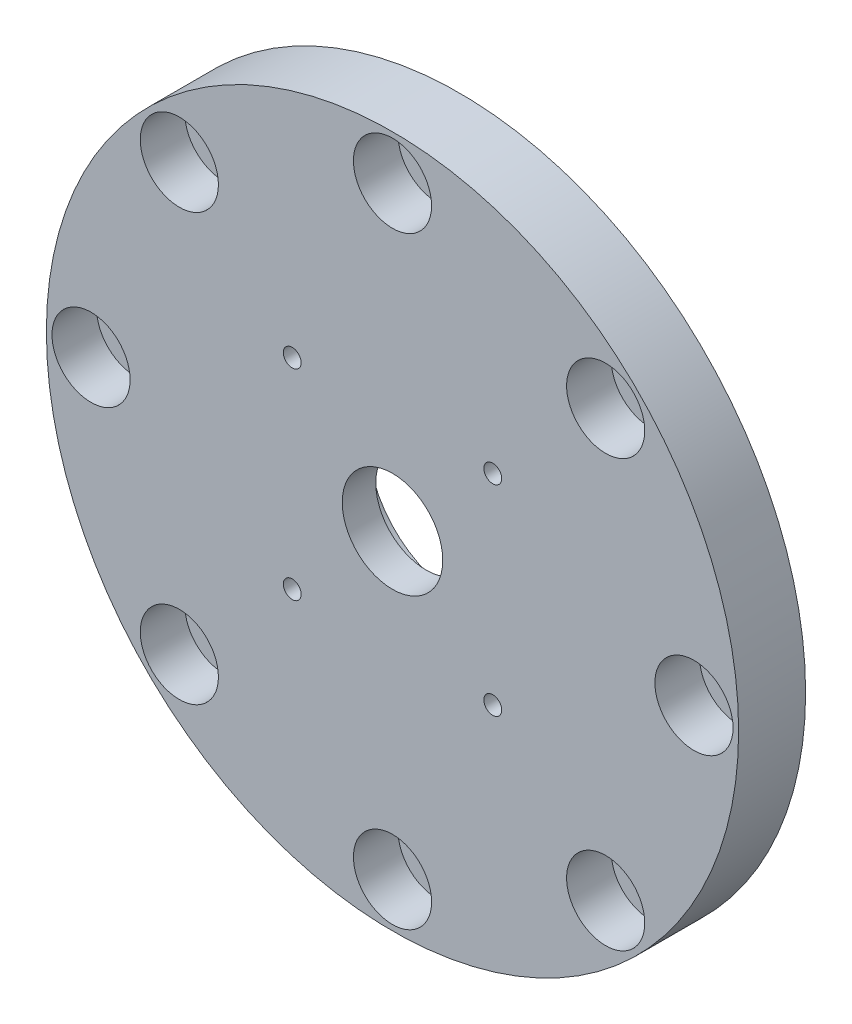
ISO-10303-21;
HEADER;
FILE_DESCRIPTION(('STEP AP214'),'2;1');
FILE_NAME('part.step','',(''),(''),'','','');
FILE_SCHEMA(('AUTOMOTIVE_DESIGN { 1 0 10303 214 1 1 1 1 }'));
ENDSEC;
DATA;
#1=APPLICATION_CONTEXT('core data for automotive mechanical design processes');
#2=APPLICATION_PROTOCOL_DEFINITION('international standard','automotive_design',2000,#1);
#3=PRODUCT_CONTEXT('',#1,'mechanical');
#4=PRODUCT('Part','Part','',(#3));
#5=PRODUCT_RELATED_PRODUCT_CATEGORY('part','',(#4));
#6=PRODUCT_DEFINITION_FORMATION('','',#4);
#7=PRODUCT_DEFINITION_CONTEXT('part definition',#1,'design');
#8=PRODUCT_DEFINITION('design','',#6,#7);
#9=PRODUCT_DEFINITION_SHAPE('','',#8);
#10=(LENGTH_UNIT() NAMED_UNIT(*) SI_UNIT(.MILLI.,.METRE.));
#11=(NAMED_UNIT(*) PLANE_ANGLE_UNIT() SI_UNIT($,.RADIAN.));
#12=(NAMED_UNIT(*) SI_UNIT($,.STERADIAN.) SOLID_ANGLE_UNIT());
#13=UNCERTAINTY_MEASURE_WITH_UNIT(LENGTH_MEASURE(1.E-05),#10,'distance_accuracy_value','');
#14=(GEOMETRIC_REPRESENTATION_CONTEXT(3) GLOBAL_UNCERTAINTY_ASSIGNED_CONTEXT((#13)) GLOBAL_UNIT_ASSIGNED_CONTEXT((#10,
#11,#12)) REPRESENTATION_CONTEXT('',''));
#15=CARTESIAN_POINT('',(0.,0.,0.));
#16=DIRECTION('',(0.,0.,1.));
#17=DIRECTION('',(1.,0.,0.));
#18=AXIS2_PLACEMENT_3D('',#15,#16,#17);
#19=CARTESIAN_POINT('',(-27.,0.,6.));
#20=DIRECTION('',(0.,0.,-1.));
#21=DIRECTION('',(-1.,0.,0.));
#22=AXIS2_PLACEMENT_3D('',#19,#20,#21);
#23=CYLINDRICAL_SURFACE('',#22,1.55);
#24=CARTESIAN_POINT('',(-27.,0.,0.));
#25=DIRECTION('',(0.,0.,1.));
#26=DIRECTION('',(1.,0.,0.));
#27=AXIS2_PLACEMENT_3D('',#24,#25,#26);
#28=CIRCLE('',#27,1.55);
#29=CARTESIAN_POINT('',(-25.45,0.,0.));
#30=VERTEX_POINT('',#29);
#31=EDGE_CURVE('E131',#30,#30,#28,.T.);
#32=ORIENTED_EDGE('',*,*,#31,.F.);
#33=EDGE_LOOP('',(#32));
#34=FACE_BOUND('',#33,.T.);
#35=CARTESIAN_POINT('',(-27.,0.,2.));
#36=DIRECTION('',(0.,0.,1.));
#37=DIRECTION('',(1.,0.,0.));
#38=AXIS2_PLACEMENT_3D('',#35,#36,#37);
#39=CIRCLE('',#38,1.55);
#40=CARTESIAN_POINT('',(-25.45,0.,2.));
#41=VERTEX_POINT('',#40);
#42=EDGE_CURVE('E39',#41,#41,#39,.T.);
#43=ORIENTED_EDGE('',*,*,#42,.T.);
#44=EDGE_LOOP('',(#43));
#45=FACE_BOUND('',#44,.T.);
#46=ADVANCED_FACE('F35',(#34,#45),#23,.F.);
#47=CARTESIAN_POINT('',(-19.0918830920367,19.0918830920368,6.));
#48=DIRECTION('',(0.,0.,-1.));
#49=DIRECTION('',(-1.,0.,0.));
#50=AXIS2_PLACEMENT_3D('',#47,#48,#49);
#51=CYLINDRICAL_SURFACE('',#50,1.54999999999999);
#52=CARTESIAN_POINT('',(-19.0918830920367,19.0918830920368,0.));
#53=DIRECTION('',(0.,0.,1.));
#54=DIRECTION('',(1.,0.,0.));
#55=AXIS2_PLACEMENT_3D('',#52,#53,#54);
#56=CIRCLE('',#55,1.54999999999999);
#57=CARTESIAN_POINT('',(-17.5418830920368,19.0918830920368,0.));
#58=VERTEX_POINT('',#57);
#59=EDGE_CURVE('E128',#58,#58,#56,.T.);
#60=ORIENTED_EDGE('',*,*,#59,.F.);
#61=EDGE_LOOP('',(#60));
#62=FACE_BOUND('',#61,.T.);
#63=CARTESIAN_POINT('',(-19.0918830920367,19.0918830920368,2.));
#64=DIRECTION('',(0.,0.,1.));
#65=DIRECTION('',(1.,0.,0.));
#66=AXIS2_PLACEMENT_3D('',#63,#64,#65);
#67=CIRCLE('',#66,1.54999999999999);
#68=CARTESIAN_POINT('',(-17.5418830920368,19.0918830920368,2.));
#69=VERTEX_POINT('',#68);
#70=EDGE_CURVE('E77',#69,#69,#67,.T.);
#71=ORIENTED_EDGE('',*,*,#70,.T.);
#72=EDGE_LOOP('',(#71));
#73=FACE_BOUND('',#72,.T.);
#74=ADVANCED_FACE('F160',(#62,#73),#51,.F.);
#75=CARTESIAN_POINT('',(0.,27.,6.));
#76=DIRECTION('',(0.,0.,-1.));
#77=DIRECTION('',(-1.,0.,0.));
#78=AXIS2_PLACEMENT_3D('',#75,#76,#77);
#79=CYLINDRICAL_SURFACE('',#78,1.55);
#80=CARTESIAN_POINT('',(0.,27.,0.));
#81=DIRECTION('',(0.,0.,1.));
#82=DIRECTION('',(1.,0.,0.));
#83=AXIS2_PLACEMENT_3D('',#80,#81,#82);
#84=CIRCLE('',#83,1.55);
#85=CARTESIAN_POINT('',(1.55000000000009,27.,0.));
#86=VERTEX_POINT('',#85);
#87=EDGE_CURVE('E125',#86,#86,#84,.T.);
#88=ORIENTED_EDGE('',*,*,#87,.F.);
#89=EDGE_LOOP('',(#88));
#90=FACE_BOUND('',#89,.T.);
#91=CARTESIAN_POINT('',(0.,27.,2.));
#92=DIRECTION('',(0.,0.,1.));
#93=DIRECTION('',(1.,0.,0.));
#94=AXIS2_PLACEMENT_3D('',#91,#92,#93);
#95=CIRCLE('',#94,1.55);
#96=CARTESIAN_POINT('',(1.55000000000009,27.,2.));
#97=VERTEX_POINT('',#96);
#98=EDGE_CURVE('E75',#97,#97,#95,.T.);
#99=ORIENTED_EDGE('',*,*,#98,.T.);
#100=EDGE_LOOP('',(#99));
#101=FACE_BOUND('',#100,.T.);
#102=ADVANCED_FACE('F166',(#90,#101),#79,.F.);
#103=CARTESIAN_POINT('',(19.0918830920369,19.0918830920367,6.));
#104=DIRECTION('',(0.,0.,-1.));
#105=DIRECTION('',(-1.,0.,0.));
#106=AXIS2_PLACEMENT_3D('',#103,#104,#105);
#107=CYLINDRICAL_SURFACE('',#106,1.55);
#108=CARTESIAN_POINT('',(19.0918830920369,19.0918830920367,0.));
#109=DIRECTION('',(0.,0.,1.));
#110=DIRECTION('',(1.,0.,0.));
#111=AXIS2_PLACEMENT_3D('',#108,#109,#110);
#112=CIRCLE('',#111,1.55);
#113=CARTESIAN_POINT('',(20.6418830920369,19.0918830920367,0.));
#114=VERTEX_POINT('',#113);
#115=EDGE_CURVE('E120',#114,#114,#112,.T.);
#116=ORIENTED_EDGE('',*,*,#115,.F.);
#117=EDGE_LOOP('',(#116));
#118=FACE_BOUND('',#117,.T.);
#119=CARTESIAN_POINT('',(19.0918830920369,19.0918830920367,2.));
#120=DIRECTION('',(0.,0.,1.));
#121=DIRECTION('',(1.,0.,0.));
#122=AXIS2_PLACEMENT_3D('',#119,#120,#121);
#123=CIRCLE('',#122,1.55);
#124=CARTESIAN_POINT('',(20.6418830920369,19.0918830920367,2.));
#125=VERTEX_POINT('',#124);
#126=EDGE_CURVE('E72',#125,#125,#123,.T.);
#127=ORIENTED_EDGE('',*,*,#126,.T.);
#128=EDGE_LOOP('',(#127));
#129=FACE_BOUND('',#128,.T.);
#130=ADVANCED_FACE('F215',(#118,#129),#107,.F.);
#131=CARTESIAN_POINT('',(27.,-1.85233445939831E-13,6.));
#132=DIRECTION('',(0.,0.,-1.));
#133=DIRECTION('',(-1.,0.,0.));
#134=AXIS2_PLACEMENT_3D('',#131,#132,#133);
#135=CYLINDRICAL_SURFACE('',#134,1.55);
#136=CARTESIAN_POINT('',(27.,-1.85233445939831E-13,0.));
#137=DIRECTION('',(0.,0.,1.));
#138=DIRECTION('',(1.,0.,0.));
#139=AXIS2_PLACEMENT_3D('',#136,#137,#138);
#140=CIRCLE('',#139,1.55);
#141=CARTESIAN_POINT('',(28.55,-1.85233445939831E-13,0.));
#142=VERTEX_POINT('',#141);
#143=EDGE_CURVE('E101',#142,#142,#140,.T.);
#144=ORIENTED_EDGE('',*,*,#143,.F.);
#145=EDGE_LOOP('',(#144));
#146=FACE_BOUND('',#145,.T.);
#147=CARTESIAN_POINT('',(27.,-1.85233445939831E-13,2.));
#148=DIRECTION('',(0.,0.,1.));
#149=DIRECTION('',(1.,0.,0.));
#150=AXIS2_PLACEMENT_3D('',#147,#148,#149);
#151=CIRCLE('',#150,1.55);
#152=CARTESIAN_POINT('',(28.55,-1.85233445939831E-13,2.));
#153=VERTEX_POINT('',#152);
#154=EDGE_CURVE('E69',#153,#153,#151,.T.);
#155=ORIENTED_EDGE('',*,*,#154,.T.);
#156=EDGE_LOOP('',(#155));
#157=FACE_BOUND('',#156,.T.);
#158=ADVANCED_FACE('F212',(#146,#157),#135,.F.);
#159=CARTESIAN_POINT('',(19.0918830920366,-19.0918830920369,6.));
#160=DIRECTION('',(0.,0.,-1.));
#161=DIRECTION('',(-1.,0.,0.));
#162=AXIS2_PLACEMENT_3D('',#159,#160,#161);
#163=CYLINDRICAL_SURFACE('',#162,1.55);
#164=CARTESIAN_POINT('',(19.0918830920366,-19.0918830920369,0.));
#165=DIRECTION('',(0.,0.,1.));
#166=DIRECTION('',(1.,0.,0.));
#167=AXIS2_PLACEMENT_3D('',#164,#165,#166);
#168=CIRCLE('',#167,1.55);
#169=CARTESIAN_POINT('',(20.6418830920366,-19.0918830920369,0.));
#170=VERTEX_POINT('',#169);
#171=EDGE_CURVE('E98',#170,#170,#168,.T.);
#172=ORIENTED_EDGE('',*,*,#171,.F.);
#173=EDGE_LOOP('',(#172));
#174=FACE_BOUND('',#173,.T.);
#175=CARTESIAN_POINT('',(19.0918830920366,-19.0918830920369,2.));
#176=DIRECTION('',(0.,0.,1.));
#177=DIRECTION('',(1.,0.,0.));
#178=AXIS2_PLACEMENT_3D('',#175,#176,#177);
#179=CIRCLE('',#178,1.55);
#180=CARTESIAN_POINT('',(20.6418830920366,-19.0918830920369,2.));
#181=VERTEX_POINT('',#180);
#182=EDGE_CURVE('E66',#181,#181,#179,.T.);
#183=ORIENTED_EDGE('',*,*,#182,.T.);
#184=EDGE_LOOP('',(#183));
#185=FACE_BOUND('',#184,.T.);
#186=ADVANCED_FACE('F208',(#174,#185),#163,.F.);
#187=CARTESIAN_POINT('',(-2.79503442088596E-13,-27.,6.));
#188=DIRECTION('',(0.,0.,-1.));
#189=DIRECTION('',(-1.,0.,0.));
#190=AXIS2_PLACEMENT_3D('',#187,#188,#189);
#191=CYLINDRICAL_SURFACE('',#190,1.55);
#192=CARTESIAN_POINT('',(-2.79503442088596E-13,-27.,0.));
#193=DIRECTION('',(0.,0.,1.));
#194=DIRECTION('',(1.,0.,0.));
#195=AXIS2_PLACEMENT_3D('',#192,#193,#194);
#196=CIRCLE('',#195,1.55);
#197=CARTESIAN_POINT('',(1.54999999999972,-27.,0.));
#198=VERTEX_POINT('',#197);
#199=EDGE_CURVE('E95',#198,#198,#196,.T.);
#200=ORIENTED_EDGE('',*,*,#199,.F.);
#201=EDGE_LOOP('',(#200));
#202=FACE_BOUND('',#201,.T.);
#203=CARTESIAN_POINT('',(-2.79503442088596E-13,-27.,2.));
#204=DIRECTION('',(0.,0.,1.));
#205=DIRECTION('',(1.,0.,0.));
#206=AXIS2_PLACEMENT_3D('',#203,#204,#205);
#207=CIRCLE('',#206,1.55);
#208=CARTESIAN_POINT('',(1.54999999999972,-27.,2.));
#209=VERTEX_POINT('',#208);
#210=EDGE_CURVE('E62',#209,#209,#207,.T.);
#211=ORIENTED_EDGE('',*,*,#210,.T.);
#212=EDGE_LOOP('',(#211));
#213=FACE_BOUND('',#212,.T.);
#214=ADVANCED_FACE('F181',(#202,#213),#191,.F.);
#215=CARTESIAN_POINT('',(-19.091883092037,-19.0918830920366,6.));
#216=DIRECTION('',(0.,0.,-1.));
#217=DIRECTION('',(-1.,0.,0.));
#218=AXIS2_PLACEMENT_3D('',#215,#216,#217);
#219=CYLINDRICAL_SURFACE('',#218,1.55);
#220=CARTESIAN_POINT('',(-19.091883092037,-19.0918830920366,0.));
#221=DIRECTION('',(0.,0.,1.));
#222=DIRECTION('',(1.,0.,0.));
#223=AXIS2_PLACEMENT_3D('',#220,#221,#222);
#224=CIRCLE('',#223,1.55);
#225=CARTESIAN_POINT('',(-17.541883092037,-19.0918830920366,0.));
#226=VERTEX_POINT('',#225);
#227=EDGE_CURVE('E57',#226,#226,#224,.T.);
#228=ORIENTED_EDGE('',*,*,#227,.F.);
#229=EDGE_LOOP('',(#228));
#230=FACE_BOUND('',#229,.T.);
#231=CARTESIAN_POINT('',(-19.091883092037,-19.0918830920366,2.));
#232=DIRECTION('',(0.,0.,1.));
#233=DIRECTION('',(1.,0.,0.));
#234=AXIS2_PLACEMENT_3D('',#231,#232,#233);
#235=CIRCLE('',#234,1.55);
#236=CARTESIAN_POINT('',(-17.541883092037,-19.0918830920366,2.));
#237=VERTEX_POINT('',#236);
#238=EDGE_CURVE('E59',#237,#237,#235,.T.);
#239=ORIENTED_EDGE('',*,*,#238,.T.);
#240=EDGE_LOOP('',(#239));
#241=FACE_BOUND('',#240,.T.);
#242=ADVANCED_FACE('F174',(#230,#241),#219,.F.);
#243=CARTESIAN_POINT('',(0.,0.,6.));
#244=DIRECTION('',(0.,0.,-1.));
#245=DIRECTION('',(-1.,0.,0.));
#246=AXIS2_PLACEMENT_3D('',#243,#244,#245);
#247=CYLINDRICAL_SURFACE('',#246,4.5);
#248=CARTESIAN_POINT('',(0.,0.,6.));
#249=DIRECTION('',(0.,0.,1.));
#250=DIRECTION('',(1.,0.,0.));
#251=AXIS2_PLACEMENT_3D('',#248,#249,#250);
#252=CIRCLE('',#251,4.5);
#253=CARTESIAN_POINT('',(4.5,0.,6.));
#254=VERTEX_POINT('',#253);
#255=EDGE_CURVE('E134',#254,#254,#252,.T.);
#256=ORIENTED_EDGE('',*,*,#255,.T.);
#257=EDGE_LOOP('',(#256));
#258=FACE_BOUND('',#257,.T.);
#259=CARTESIAN_POINT('',(0.,0.,3.));
#260=DIRECTION('',(0.,0.,-1.));
#261=DIRECTION('',(-1.,0.,0.));
#262=AXIS2_PLACEMENT_3D('',#259,#260,#261);
#263=CIRCLE('',#262,4.5);
#264=CARTESIAN_POINT('',(-4.5,0.,3.));
#265=VERTEX_POINT('',#264);
#266=EDGE_CURVE('E54',#265,#265,#263,.T.);
#267=ORIENTED_EDGE('',*,*,#266,.T.);
#268=EDGE_LOOP('',(#267));
#269=FACE_BOUND('',#268,.T.);
#270=ADVANCED_FACE('F171',(#258,#269),#247,.F.);
#271=CARTESIAN_POINT('',(0.,0.,6.));
#272=DIRECTION('',(0.,0.,1.));
#273=DIRECTION('',(1.,0.,0.));
#274=AXIS2_PLACEMENT_3D('',#271,#272,#273);
#275=PLANE('',#274);
#276=CARTESIAN_POINT('',(0.,27.,6.));
#277=DIRECTION('',(0.,0.,1.));
#278=DIRECTION('',(1.,0.,0.));
#279=AXIS2_PLACEMENT_3D('',#276,#277,#278);
#280=CIRCLE('',#279,3.5);
#281=CARTESIAN_POINT('',(3.50000000000009,27.,6.));
#282=VERTEX_POINT('',#281);
#283=EDGE_CURVE('E240',#282,#282,#280,.T.);
#284=ORIENTED_EDGE('',*,*,#283,.F.);
#285=EDGE_LOOP('',(#284));
#286=FACE_BOUND('',#285,.T.);
#287=CARTESIAN_POINT('',(19.0918830920372,19.0918830920375,6.));
#288=DIRECTION('',(0.,0.,1.));
#289=DIRECTION('',(1.,0.,0.));
#290=AXIS2_PLACEMENT_3D('',#287,#288,#289);
#291=CIRCLE('',#290,3.50000000000013);
#292=CARTESIAN_POINT('',(22.5918830920373,19.0918830920375,6.));
#293=VERTEX_POINT('',#292);
#294=EDGE_CURVE('E248',#293,#293,#291,.T.);
#295=ORIENTED_EDGE('',*,*,#294,.F.);
#296=EDGE_LOOP('',(#295));
#297=FACE_BOUND('',#296,.T.);
#298=CARTESIAN_POINT('',(27.0000000000011,1.05184941624605E-12,6.));
#299=DIRECTION('',(0.,0.,1.));
#300=DIRECTION('',(1.,0.,0.));
#301=AXIS2_PLACEMENT_3D('',#298,#299,#300);
#302=CIRCLE('',#301,3.50000000000085);
#303=CARTESIAN_POINT('',(30.500000000002,1.05184941624605E-12,6.));
#304=VERTEX_POINT('',#303);
#305=EDGE_CURVE('E254',#304,#304,#302,.T.);
#306=ORIENTED_EDGE('',*,*,#305,.F.);
#307=EDGE_LOOP('',(#306));
#308=FACE_BOUND('',#307,.T.);
#309=CARTESIAN_POINT('',(19.0918830920387,-19.091883092036,6.));
#310=DIRECTION('',(0.,0.,1.));
#311=DIRECTION('',(1.,0.,0.));
#312=AXIS2_PLACEMENT_3D('',#309,#310,#311);
#313=CIRCLE('',#312,3.50000000000177);
#314=CARTESIAN_POINT('',(22.5918830920404,-19.091883092036,6.));
#315=VERTEX_POINT('',#314);
#316=EDGE_CURVE('E260',#315,#315,#313,.T.);
#317=ORIENTED_EDGE('',*,*,#316,.F.);
#318=EDGE_LOOP('',(#317));
#319=FACE_BOUND('',#318,.T.);
#320=CARTESIAN_POINT('',(2.19466228228317E-12,-27.,6.));
#321=DIRECTION('',(0.,0.,1.));
#322=DIRECTION('',(1.,0.,0.));
#323=AXIS2_PLACEMENT_3D('',#320,#321,#322);
#324=CIRCLE('',#323,3.50000000000237);
#325=CARTESIAN_POINT('',(3.50000000000456,-27.,6.));
#326=VERTEX_POINT('',#325);
#327=EDGE_CURVE('E266',#326,#326,#324,.T.);
#328=ORIENTED_EDGE('',*,*,#327,.F.);
#329=EDGE_LOOP('',(#328));
#330=FACE_BOUND('',#329,.T.);
#331=CARTESIAN_POINT('',(-19.0918830920349,-19.0918830920375,6.));
#332=DIRECTION('',(0.,0.,1.));
#333=DIRECTION('',(1.,0.,0.));
#334=AXIS2_PLACEMENT_3D('',#331,#332,#333);
#335=CIRCLE('',#334,3.50000000000232);
#336=CARTESIAN_POINT('',(-15.5918830920326,-19.0918830920375,6.));
#337=VERTEX_POINT('',#336);
#338=EDGE_CURVE('E272',#337,#337,#335,.T.);
#339=ORIENTED_EDGE('',*,*,#338,.F.);
#340=EDGE_LOOP('',(#339));
#341=FACE_BOUND('',#340,.T.);
#342=CARTESIAN_POINT('',(-26.9999999999989,-1.05515596260375E-12,6.));
#343=DIRECTION('',(0.,0.,1.));
#344=DIRECTION('',(1.,0.,0.));
#345=AXIS2_PLACEMENT_3D('',#342,#343,#344);
#346=CIRCLE('',#345,3.5000000000017);
#347=CARTESIAN_POINT('',(-23.4999999999972,-1.05515596260375E-12,6.));
#348=VERTEX_POINT('',#347);
#349=EDGE_CURVE('E278',#348,#348,#346,.T.);
#350=ORIENTED_EDGE('',*,*,#349,.F.);
#351=EDGE_LOOP('',(#350));
#352=FACE_BOUND('',#351,.T.);
#353=CARTESIAN_POINT('',(-19.0918830920364,19.091883092036,6.));
#354=DIRECTION('',(0.,0.,1.));
#355=DIRECTION('',(1.,0.,0.));
#356=AXIS2_PLACEMENT_3D('',#353,#354,#355);
#357=CIRCLE('',#356,3.50000000000088);
#358=CARTESIAN_POINT('',(-15.5918830920355,19.091883092036,6.));
#359=VERTEX_POINT('',#358);
#360=EDGE_CURVE('E283',#359,#359,#357,.T.);
#361=ORIENTED_EDGE('',*,*,#360,.F.);
#362=EDGE_LOOP('',(#361));
#363=FACE_BOUND('',#362,.T.);
#364=CARTESIAN_POINT('',(-8.98025612106779,-8.9802561210699,6.));
#365=DIRECTION('',(0.,0.,1.));
#366=DIRECTION('',(1.,0.,0.));
#367=AXIS2_PLACEMENT_3D('',#364,#365,#366);
#368=CIRCLE('',#367,0.800000000000001);
#369=CARTESIAN_POINT('',(-8.18025612106779,-8.9802561210699,6.));
#370=VERTEX_POINT('',#369);
#371=EDGE_CURVE('E111',#370,#370,#368,.T.);
#372=ORIENTED_EDGE('',*,*,#371,.F.);
#373=EDGE_LOOP('',(#372));
#374=FACE_BOUND('',#373,.T.);
#375=ORIENTED_EDGE('',*,*,#255,.F.);
#376=EDGE_LOOP('',(#375));
#377=FACE_BOUND('',#376,.T.);
#378=CARTESIAN_POINT('',(0.,0.,6.));
#379=DIRECTION('',(0.,0.,1.));
#380=DIRECTION('',(1.,0.,0.));
#381=AXIS2_PLACEMENT_3D('',#378,#379,#380);
#382=CIRCLE('',#381,31.);
#383=CARTESIAN_POINT('',(31.,0.,6.));
#384=VERTEX_POINT('',#383);
#385=EDGE_CURVE('E10',#384,#384,#382,.T.);
#386=ORIENTED_EDGE('',*,*,#385,.T.);
#387=EDGE_LOOP('',(#386));
#388=FACE_BOUND('',#387,.T.);
#389=CARTESIAN_POINT('',(8.98025612106914,8.98025612106917,6.));
#390=DIRECTION('',(0.,0.,1.));
#391=DIRECTION('',(1.,0.,0.));
#392=AXIS2_PLACEMENT_3D('',#389,#390,#391);
#393=CIRCLE('',#392,0.800000000000001);
#394=CARTESIAN_POINT('',(9.78025612106914,8.98025612106917,6.));
#395=VERTEX_POINT('',#394);
#396=EDGE_CURVE('E48',#395,#395,#393,.T.);
#397=ORIENTED_EDGE('',*,*,#396,.F.);
#398=EDGE_LOOP('',(#397));
#399=FACE_BOUND('',#398,.T.);
#400=CARTESIAN_POINT('',(8.98025612106965,-8.98025612106915,6.));
#401=DIRECTION('',(0.,0.,1.));
#402=DIRECTION('',(1.,0.,0.));
#403=AXIS2_PLACEMENT_3D('',#400,#401,#402);
#404=CIRCLE('',#403,0.800000000000001);
#405=CARTESIAN_POINT('',(9.78025612106965,-8.98025612106915,6.));
#406=VERTEX_POINT('',#405);
#407=EDGE_CURVE('E117',#406,#406,#404,.T.);
#408=ORIENTED_EDGE('',*,*,#407,.F.);
#409=EDGE_LOOP('',(#408));
#410=FACE_BOUND('',#409,.T.);
#411=CARTESIAN_POINT('',(-8.98025612106915,8.98025612106865,6.));
#412=DIRECTION('',(0.,0.,1.));
#413=DIRECTION('',(1.,0.,0.));
#414=AXIS2_PLACEMENT_3D('',#411,#412,#413);
#415=CIRCLE('',#414,0.800000000000001);
#416=CARTESIAN_POINT('',(-8.18025612106915,8.98025612106865,6.));
#417=VERTEX_POINT('',#416);
#418=EDGE_CURVE('E105',#417,#417,#415,.T.);
#419=ORIENTED_EDGE('',*,*,#418,.F.);
#420=EDGE_LOOP('',(#419));
#421=FACE_BOUND('',#420,.T.);
#422=ADVANCED_FACE('F173',(#286,#297,#308,#319,#330,#341,#352,#363,#374,#377,#388,#399,#410,
#421),#275,.T.);
#423=CARTESIAN_POINT('',(0.,0.,0.));
#424=DIRECTION('',(0.,0.,1.));
#425=DIRECTION('',(1.,0.,0.));
#426=AXIS2_PLACEMENT_3D('',#423,#424,#425);
#427=PLANE('',#426);
#428=CARTESIAN_POINT('',(0.,0.,0.));
#429=DIRECTION('',(0.,0.,-1.));
#430=DIRECTION('',(-1.,0.,0.));
#431=AXIS2_PLACEMENT_3D('',#428,#429,#430);
#432=CIRCLE('',#431,8.2);
#433=CARTESIAN_POINT('',(-8.2,0.,0.));
#434=VERTEX_POINT('',#433);
#435=EDGE_CURVE('E82',#434,#434,#432,.T.);
#436=ORIENTED_EDGE('',*,*,#435,.F.);
#437=EDGE_LOOP('',(#436));
#438=FACE_BOUND('',#437,.T.);
#439=CARTESIAN_POINT('',(0.,0.,0.));
#440=DIRECTION('',(0.,0.,1.));
#441=DIRECTION('',(1.,0.,0.));
#442=AXIS2_PLACEMENT_3D('',#439,#440,#441);
#443=CIRCLE('',#442,31.);
#444=CARTESIAN_POINT('',(31.,0.,0.));
#445=VERTEX_POINT('',#444);
#446=EDGE_CURVE('E43',#445,#445,#443,.T.);
#447=ORIENTED_EDGE('',*,*,#446,.F.);
#448=EDGE_LOOP('',(#447));
#449=FACE_BOUND('',#448,.T.);
#450=CARTESIAN_POINT('',(8.98025612106914,8.98025612106917,0.));
#451=DIRECTION('',(0.,0.,1.));
#452=DIRECTION('',(1.,0.,0.));
#453=AXIS2_PLACEMENT_3D('',#450,#451,#452);
#454=CIRCLE('',#453,0.800000000000001);
#455=CARTESIAN_POINT('',(9.78025612106914,8.98025612106917,0.));
#456=VERTEX_POINT('',#455);
#457=EDGE_CURVE('E51',#456,#456,#454,.T.);
#458=ORIENTED_EDGE('',*,*,#457,.T.);
#459=EDGE_LOOP('',(#458));
#460=FACE_BOUND('',#459,.T.);
#461=ORIENTED_EDGE('',*,*,#31,.T.);
#462=EDGE_LOOP('',(#461));
#463=FACE_BOUND('',#462,.T.);
#464=ORIENTED_EDGE('',*,*,#59,.T.);
#465=EDGE_LOOP('',(#464));
#466=FACE_BOUND('',#465,.T.);
#467=ORIENTED_EDGE('',*,*,#87,.T.);
#468=EDGE_LOOP('',(#467));
#469=FACE_BOUND('',#468,.T.);
#470=ORIENTED_EDGE('',*,*,#115,.T.);
#471=EDGE_LOOP('',(#470));
#472=FACE_BOUND('',#471,.T.);
#473=CARTESIAN_POINT('',(8.98025612106965,-8.98025612106915,0.));
#474=DIRECTION('',(0.,0.,1.));
#475=DIRECTION('',(1.,0.,0.));
#476=AXIS2_PLACEMENT_3D('',#473,#474,#475);
#477=CIRCLE('',#476,0.800000000000001);
#478=CARTESIAN_POINT('',(9.78025612106965,-8.98025612106915,0.));
#479=VERTEX_POINT('',#478);
#480=EDGE_CURVE('E114',#479,#479,#477,.T.);
#481=ORIENTED_EDGE('',*,*,#480,.T.);
#482=EDGE_LOOP('',(#481));
#483=FACE_BOUND('',#482,.T.);
#484=CARTESIAN_POINT('',(-8.98025612106779,-8.9802561210699,0.));
#485=DIRECTION('',(0.,0.,1.));
#486=DIRECTION('',(1.,0.,0.));
#487=AXIS2_PLACEMENT_3D('',#484,#485,#486);
#488=CIRCLE('',#487,0.800000000000001);
#489=CARTESIAN_POINT('',(-8.18025612106779,-8.9802561210699,0.));
#490=VERTEX_POINT('',#489);
#491=EDGE_CURVE('E108',#490,#490,#488,.T.);
#492=ORIENTED_EDGE('',*,*,#491,.T.);
#493=EDGE_LOOP('',(#492));
#494=FACE_BOUND('',#493,.T.);
#495=CARTESIAN_POINT('',(-8.98025612106915,8.98025612106865,0.));
#496=DIRECTION('',(0.,0.,1.));
#497=DIRECTION('',(1.,0.,0.));
#498=AXIS2_PLACEMENT_3D('',#495,#496,#497);
#499=CIRCLE('',#498,0.800000000000001);
#500=CARTESIAN_POINT('',(-8.18025612106915,8.98025612106865,0.));
#501=VERTEX_POINT('',#500);
#502=EDGE_CURVE('E104',#501,#501,#499,.T.);
#503=ORIENTED_EDGE('',*,*,#502,.T.);
#504=EDGE_LOOP('',(#503));
#505=FACE_BOUND('',#504,.T.);
#506=ORIENTED_EDGE('',*,*,#143,.T.);
#507=EDGE_LOOP('',(#506));
#508=FACE_BOUND('',#507,.T.);
#509=ORIENTED_EDGE('',*,*,#171,.T.);
#510=EDGE_LOOP('',(#509));
#511=FACE_BOUND('',#510,.T.);
#512=ORIENTED_EDGE('',*,*,#199,.T.);
#513=EDGE_LOOP('',(#512));
#514=FACE_BOUND('',#513,.T.);
#515=ORIENTED_EDGE('',*,*,#227,.T.);
#516=EDGE_LOOP('',(#515));
#517=FACE_BOUND('',#516,.T.);
#518=ADVANCED_FACE('F142',(#438,#449,#460,#463,#466,#469,#472,#483,#494,#505,#508,#511,#514,
#517),#427,.F.);
#519=CARTESIAN_POINT('',(0.,0.,6.));
#520=DIRECTION('',(0.,0.,-1.));
#521=DIRECTION('',(-1.,0.,0.));
#522=AXIS2_PLACEMENT_3D('',#519,#520,#521);
#523=CYLINDRICAL_SURFACE('',#522,31.);
#524=ORIENTED_EDGE('',*,*,#385,.F.);
#525=EDGE_LOOP('',(#524));
#526=FACE_BOUND('',#525,.T.);
#527=ORIENTED_EDGE('',*,*,#446,.T.);
#528=EDGE_LOOP('',(#527));
#529=FACE_BOUND('',#528,.T.);
#530=ADVANCED_FACE('F37',(#526,#529),#523,.T.);
#531=CARTESIAN_POINT('',(8.98025612106914,8.98025612106917,6.));
#532=DIRECTION('',(0.,0.,-1.));
#533=DIRECTION('',(-1.,0.,0.));
#534=AXIS2_PLACEMENT_3D('',#531,#532,#533);
#535=CYLINDRICAL_SURFACE('',#534,0.800000000000001);
#536=ORIENTED_EDGE('',*,*,#396,.T.);
#537=EDGE_LOOP('',(#536));
#538=FACE_BOUND('',#537,.T.);
#539=ORIENTED_EDGE('',*,*,#457,.F.);
#540=EDGE_LOOP('',(#539));
#541=FACE_BOUND('',#540,.T.);
#542=ADVANCED_FACE('F145',(#538,#541),#535,.F.);
#543=CARTESIAN_POINT('',(8.98025612106965,-8.98025612106915,6.));
#544=DIRECTION('',(0.,0.,-1.));
#545=DIRECTION('',(-1.,0.,0.));
#546=AXIS2_PLACEMENT_3D('',#543,#544,#545);
#547=CYLINDRICAL_SURFACE('',#546,0.800000000000001);
#548=ORIENTED_EDGE('',*,*,#407,.T.);
#549=EDGE_LOOP('',(#548));
#550=FACE_BOUND('',#549,.T.);
#551=ORIENTED_EDGE('',*,*,#480,.F.);
#552=EDGE_LOOP('',(#551));
#553=FACE_BOUND('',#552,.T.);
#554=ADVANCED_FACE('F147',(#550,#553),#547,.F.);
#555=CARTESIAN_POINT('',(-8.98025612106779,-8.9802561210699,6.));
#556=DIRECTION('',(0.,0.,-1.));
#557=DIRECTION('',(-1.,0.,0.));
#558=AXIS2_PLACEMENT_3D('',#555,#556,#557);
#559=CYLINDRICAL_SURFACE('',#558,0.800000000000001);
#560=ORIENTED_EDGE('',*,*,#371,.T.);
#561=EDGE_LOOP('',(#560));
#562=FACE_BOUND('',#561,.T.);
#563=ORIENTED_EDGE('',*,*,#491,.F.);
#564=EDGE_LOOP('',(#563));
#565=FACE_BOUND('',#564,.T.);
#566=ADVANCED_FACE('F153',(#562,#565),#559,.F.);
#567=CARTESIAN_POINT('',(-8.98025612106915,8.98025612106865,6.));
#568=DIRECTION('',(0.,0.,-1.));
#569=DIRECTION('',(-1.,0.,0.));
#570=AXIS2_PLACEMENT_3D('',#567,#568,#569);
#571=CYLINDRICAL_SURFACE('',#570,0.800000000000001);
#572=ORIENTED_EDGE('',*,*,#418,.T.);
#573=EDGE_LOOP('',(#572));
#574=FACE_BOUND('',#573,.T.);
#575=ORIENTED_EDGE('',*,*,#502,.F.);
#576=EDGE_LOOP('',(#575));
#577=FACE_BOUND('',#576,.T.);
#578=ADVANCED_FACE('F197',(#574,#577),#571,.F.);
#579=CARTESIAN_POINT('',(0.,0.,3.));
#580=DIRECTION('',(0.,0.,-1.));
#581=DIRECTION('',(-1.,0.,0.));
#582=AXIS2_PLACEMENT_3D('',#579,#580,#581);
#583=CYLINDRICAL_SURFACE('',#582,8.2);
#584=CARTESIAN_POINT('',(0.,0.,3.));
#585=DIRECTION('',(0.,0.,-1.));
#586=DIRECTION('',(-1.,0.,0.));
#587=AXIS2_PLACEMENT_3D('',#584,#585,#586);
#588=CIRCLE('',#587,8.2);
#589=CARTESIAN_POINT('',(-8.2,0.,3.));
#590=VERTEX_POINT('',#589);
#591=EDGE_CURVE('E58',#590,#590,#588,.T.);
#592=ORIENTED_EDGE('',*,*,#591,.F.);
#593=EDGE_LOOP('',(#592));
#594=FACE_BOUND('',#593,.T.);
#595=ORIENTED_EDGE('',*,*,#435,.T.);
#596=EDGE_LOOP('',(#595));
#597=FACE_BOUND('',#596,.T.);
#598=ADVANCED_FACE('F192',(#594,#597),#583,.F.);
#599=CARTESIAN_POINT('',(0.,0.,3.));
#600=DIRECTION('',(0.,0.,-1.));
#601=DIRECTION('',(-1.,0.,0.));
#602=AXIS2_PLACEMENT_3D('',#599,#600,#601);
#603=PLANE('',#602);
#604=ORIENTED_EDGE('',*,*,#266,.F.);
#605=EDGE_LOOP('',(#604));
#606=FACE_BOUND('',#605,.T.);
#607=ORIENTED_EDGE('',*,*,#591,.T.);
#608=EDGE_LOOP('',(#607));
#609=FACE_BOUND('',#608,.T.);
#610=ADVANCED_FACE('F188',(#606,#609),#603,.T.);
#611=CARTESIAN_POINT('',(-19.0918830920349,-19.0918830920375,2.));
#612=DIRECTION('',(0.,0.,1.));
#613=DIRECTION('',(1.,0.,0.));
#614=AXIS2_PLACEMENT_3D('',#611,#612,#613);
#615=CYLINDRICAL_SURFACE('',#614,3.50000000000232);
#616=CARTESIAN_POINT('',(-19.0918830920349,-19.0918830920375,2.));
#617=DIRECTION('',(0.,0.,1.));
#618=DIRECTION('',(1.,0.,0.));
#619=AXIS2_PLACEMENT_3D('',#616,#617,#618);
#620=CIRCLE('',#619,3.50000000000232);
#621=CARTESIAN_POINT('',(-15.5918830920326,-19.0918830920375,2.));
#622=VERTEX_POINT('',#621);
#623=EDGE_CURVE('E269',#622,#622,#620,.T.);
#624=ORIENTED_EDGE('',*,*,#623,.F.);
#625=EDGE_LOOP('',(#624));
#626=FACE_BOUND('',#625,.T.);
#627=ORIENTED_EDGE('',*,*,#338,.T.);
#628=EDGE_LOOP('',(#627));
#629=FACE_BOUND('',#628,.T.);
#630=ADVANCED_FACE('F191',(#626,#629),#615,.F.);
#631=CARTESIAN_POINT('',(-19.0918830920349,-19.0918830920375,2.));
#632=DIRECTION('',(0.,0.,1.));
#633=DIRECTION('',(1.,0.,0.));
#634=AXIS2_PLACEMENT_3D('',#631,#632,#633);
#635=PLANE('',#634);
#636=ORIENTED_EDGE('',*,*,#238,.F.);
#637=EDGE_LOOP('',(#636));
#638=FACE_BOUND('',#637,.T.);
#639=ORIENTED_EDGE('',*,*,#623,.T.);
#640=EDGE_LOOP('',(#639));
#641=FACE_BOUND('',#640,.T.);
#642=ADVANCED_FACE('F312',(#638,#641),#635,.T.);
#643=CARTESIAN_POINT('',(2.19466228228317E-12,-27.,2.));
#644=DIRECTION('',(0.,0.,1.));
#645=DIRECTION('',(1.,0.,0.));
#646=AXIS2_PLACEMENT_3D('',#643,#644,#645);
#647=CYLINDRICAL_SURFACE('',#646,3.50000000000237);
#648=CARTESIAN_POINT('',(2.19466228228317E-12,-27.,2.));
#649=DIRECTION('',(0.,0.,1.));
#650=DIRECTION('',(1.,0.,0.));
#651=AXIS2_PLACEMENT_3D('',#648,#649,#650);
#652=CIRCLE('',#651,3.50000000000237);
#653=CARTESIAN_POINT('',(3.50000000000456,-27.,2.));
#654=VERTEX_POINT('',#653);
#655=EDGE_CURVE('E263',#654,#654,#652,.T.);
#656=ORIENTED_EDGE('',*,*,#655,.F.);
#657=EDGE_LOOP('',(#656));
#658=FACE_BOUND('',#657,.T.);
#659=ORIENTED_EDGE('',*,*,#327,.T.);
#660=EDGE_LOOP('',(#659));
#661=FACE_BOUND('',#660,.T.);
#662=ADVANCED_FACE('F315',(#658,#661),#647,.F.);
#663=CARTESIAN_POINT('',(2.19466228228317E-12,-27.,2.));
#664=DIRECTION('',(0.,0.,1.));
#665=DIRECTION('',(1.,0.,0.));
#666=AXIS2_PLACEMENT_3D('',#663,#664,#665);
#667=PLANE('',#666);
#668=ORIENTED_EDGE('',*,*,#210,.F.);
#669=EDGE_LOOP('',(#668));
#670=FACE_BOUND('',#669,.T.);
#671=ORIENTED_EDGE('',*,*,#655,.T.);
#672=EDGE_LOOP('',(#671));
#673=FACE_BOUND('',#672,.T.);
#674=ADVANCED_FACE('F433',(#670,#673),#667,.T.);
#675=CARTESIAN_POINT('',(19.0918830920387,-19.091883092036,2.));
#676=DIRECTION('',(0.,0.,1.));
#677=DIRECTION('',(1.,0.,0.));
#678=AXIS2_PLACEMENT_3D('',#675,#676,#677);
#679=CYLINDRICAL_SURFACE('',#678,3.50000000000177);
#680=CARTESIAN_POINT('',(19.0918830920387,-19.091883092036,2.));
#681=DIRECTION('',(0.,0.,1.));
#682=DIRECTION('',(1.,0.,0.));
#683=AXIS2_PLACEMENT_3D('',#680,#681,#682);
#684=CIRCLE('',#683,3.50000000000177);
#685=CARTESIAN_POINT('',(22.5918830920404,-19.091883092036,2.));
#686=VERTEX_POINT('',#685);
#687=EDGE_CURVE('E257',#686,#686,#684,.T.);
#688=ORIENTED_EDGE('',*,*,#687,.F.);
#689=EDGE_LOOP('',(#688));
#690=FACE_BOUND('',#689,.T.);
#691=ORIENTED_EDGE('',*,*,#316,.T.);
#692=EDGE_LOOP('',(#691));
#693=FACE_BOUND('',#692,.T.);
#694=ADVANCED_FACE('F424',(#690,#693),#679,.F.);
#695=CARTESIAN_POINT('',(19.0918830920387,-19.091883092036,2.));
#696=DIRECTION('',(0.,0.,1.));
#697=DIRECTION('',(1.,0.,0.));
#698=AXIS2_PLACEMENT_3D('',#695,#696,#697);
#699=PLANE('',#698);
#700=ORIENTED_EDGE('',*,*,#182,.F.);
#701=EDGE_LOOP('',(#700));
#702=FACE_BOUND('',#701,.T.);
#703=ORIENTED_EDGE('',*,*,#687,.T.);
#704=EDGE_LOOP('',(#703));
#705=FACE_BOUND('',#704,.T.);
#706=ADVANCED_FACE('F415',(#702,#705),#699,.T.);
#707=CARTESIAN_POINT('',(27.0000000000011,1.05184941624605E-12,2.));
#708=DIRECTION('',(0.,0.,1.));
#709=DIRECTION('',(1.,0.,0.));
#710=AXIS2_PLACEMENT_3D('',#707,#708,#709);
#711=CYLINDRICAL_SURFACE('',#710,3.50000000000085);
#712=CARTESIAN_POINT('',(27.0000000000011,1.05184941624605E-12,2.));
#713=DIRECTION('',(0.,0.,1.));
#714=DIRECTION('',(1.,0.,0.));
#715=AXIS2_PLACEMENT_3D('',#712,#713,#714);
#716=CIRCLE('',#715,3.50000000000085);
#717=CARTESIAN_POINT('',(30.500000000002,1.05184941624605E-12,2.));
#718=VERTEX_POINT('',#717);
#719=EDGE_CURVE('E251',#718,#718,#716,.T.);
#720=ORIENTED_EDGE('',*,*,#719,.F.);
#721=EDGE_LOOP('',(#720));
#722=FACE_BOUND('',#721,.T.);
#723=ORIENTED_EDGE('',*,*,#305,.T.);
#724=EDGE_LOOP('',(#723));
#725=FACE_BOUND('',#724,.T.);
#726=ADVANCED_FACE('F406',(#722,#725),#711,.F.);
#727=CARTESIAN_POINT('',(27.0000000000011,1.05184941624605E-12,2.));
#728=DIRECTION('',(0.,0.,1.));
#729=DIRECTION('',(1.,0.,0.));
#730=AXIS2_PLACEMENT_3D('',#727,#728,#729);
#731=PLANE('',#730);
#732=ORIENTED_EDGE('',*,*,#154,.F.);
#733=EDGE_LOOP('',(#732));
#734=FACE_BOUND('',#733,.T.);
#735=ORIENTED_EDGE('',*,*,#719,.T.);
#736=EDGE_LOOP('',(#735));
#737=FACE_BOUND('',#736,.T.);
#738=ADVANCED_FACE('F397',(#734,#737),#731,.T.);
#739=CARTESIAN_POINT('',(19.0918830920372,19.0918830920375,2.));
#740=DIRECTION('',(0.,0.,1.));
#741=DIRECTION('',(1.,0.,0.));
#742=AXIS2_PLACEMENT_3D('',#739,#740,#741);
#743=CYLINDRICAL_SURFACE('',#742,3.50000000000013);
#744=CARTESIAN_POINT('',(19.0918830920372,19.0918830920375,2.));
#745=DIRECTION('',(0.,0.,1.));
#746=DIRECTION('',(1.,0.,0.));
#747=AXIS2_PLACEMENT_3D('',#744,#745,#746);
#748=CIRCLE('',#747,3.50000000000013);
#749=CARTESIAN_POINT('',(22.5918830920373,19.0918830920375,2.));
#750=VERTEX_POINT('',#749);
#751=EDGE_CURVE('E243',#750,#750,#748,.T.);
#752=ORIENTED_EDGE('',*,*,#751,.F.);
#753=EDGE_LOOP('',(#752));
#754=FACE_BOUND('',#753,.T.);
#755=ORIENTED_EDGE('',*,*,#294,.T.);
#756=EDGE_LOOP('',(#755));
#757=FACE_BOUND('',#756,.T.);
#758=ADVANCED_FACE('F388',(#754,#757),#743,.F.);
#759=CARTESIAN_POINT('',(19.0918830920372,19.0918830920375,2.));
#760=DIRECTION('',(0.,0.,1.));
#761=DIRECTION('',(1.,0.,0.));
#762=AXIS2_PLACEMENT_3D('',#759,#760,#761);
#763=PLANE('',#762);
#764=ORIENTED_EDGE('',*,*,#126,.F.);
#765=EDGE_LOOP('',(#764));
#766=FACE_BOUND('',#765,.T.);
#767=ORIENTED_EDGE('',*,*,#751,.T.);
#768=EDGE_LOOP('',(#767));
#769=FACE_BOUND('',#768,.T.);
#770=ADVANCED_FACE('F380',(#766,#769),#763,.T.);
#771=CARTESIAN_POINT('',(0.,27.,2.));
#772=DIRECTION('',(0.,0.,1.));
#773=DIRECTION('',(1.,0.,0.));
#774=AXIS2_PLACEMENT_3D('',#771,#772,#773);
#775=CYLINDRICAL_SURFACE('',#774,3.5);
#776=CARTESIAN_POINT('',(0.,27.,2.));
#777=DIRECTION('',(0.,0.,1.));
#778=DIRECTION('',(1.,0.,0.));
#779=AXIS2_PLACEMENT_3D('',#776,#777,#778);
#780=CIRCLE('',#779,3.5);
#781=CARTESIAN_POINT('',(3.50000000000009,27.,2.));
#782=VERTEX_POINT('',#781);
#783=EDGE_CURVE('E63',#782,#782,#780,.T.);
#784=ORIENTED_EDGE('',*,*,#783,.F.);
#785=EDGE_LOOP('',(#784));
#786=FACE_BOUND('',#785,.T.);
#787=ORIENTED_EDGE('',*,*,#283,.T.);
#788=EDGE_LOOP('',(#787));
#789=FACE_BOUND('',#788,.T.);
#790=ADVANCED_FACE('F235',(#786,#789),#775,.F.);
#791=CARTESIAN_POINT('',(0.,27.,2.));
#792=DIRECTION('',(0.,0.,1.));
#793=DIRECTION('',(1.,0.,0.));
#794=AXIS2_PLACEMENT_3D('',#791,#792,#793);
#795=PLANE('',#794);
#796=ORIENTED_EDGE('',*,*,#98,.F.);
#797=EDGE_LOOP('',(#796));
#798=FACE_BOUND('',#797,.T.);
#799=ORIENTED_EDGE('',*,*,#783,.T.);
#800=EDGE_LOOP('',(#799));
#801=FACE_BOUND('',#800,.T.);
#802=ADVANCED_FACE('F231',(#798,#801),#795,.T.);
#803=CARTESIAN_POINT('',(-19.0918830920364,19.091883092036,2.));
#804=DIRECTION('',(0.,0.,1.));
#805=DIRECTION('',(1.,0.,0.));
#806=AXIS2_PLACEMENT_3D('',#803,#804,#805);
#807=CYLINDRICAL_SURFACE('',#806,3.50000000000088);
#808=CARTESIAN_POINT('',(-19.0918830920364,19.091883092036,2.));
#809=DIRECTION('',(0.,0.,1.));
#810=DIRECTION('',(1.,0.,0.));
#811=AXIS2_PLACEMENT_3D('',#808,#809,#810);
#812=CIRCLE('',#811,3.50000000000088);
#813=CARTESIAN_POINT('',(-15.5918830920355,19.091883092036,2.));
#814=VERTEX_POINT('',#813);
#815=EDGE_CURVE('E281',#814,#814,#812,.T.);
#816=ORIENTED_EDGE('',*,*,#815,.F.);
#817=EDGE_LOOP('',(#816));
#818=FACE_BOUND('',#817,.T.);
#819=ORIENTED_EDGE('',*,*,#360,.T.);
#820=EDGE_LOOP('',(#819));
#821=FACE_BOUND('',#820,.T.);
#822=ADVANCED_FACE('F234',(#818,#821),#807,.F.);
#823=CARTESIAN_POINT('',(-19.0918830920364,19.091883092036,2.));
#824=DIRECTION('',(0.,0.,1.));
#825=DIRECTION('',(1.,0.,0.));
#826=AXIS2_PLACEMENT_3D('',#823,#824,#825);
#827=PLANE('',#826);
#828=ORIENTED_EDGE('',*,*,#70,.F.);
#829=EDGE_LOOP('',(#828));
#830=FACE_BOUND('',#829,.T.);
#831=ORIENTED_EDGE('',*,*,#815,.T.);
#832=EDGE_LOOP('',(#831));
#833=FACE_BOUND('',#832,.T.);
#834=ADVANCED_FACE('F330',(#830,#833),#827,.T.);
#835=CARTESIAN_POINT('',(-26.9999999999989,-1.05515596260375E-12,2.));
#836=DIRECTION('',(0.,0.,1.));
#837=DIRECTION('',(1.,0.,0.));
#838=AXIS2_PLACEMENT_3D('',#835,#836,#837);
#839=CYLINDRICAL_SURFACE('',#838,3.5000000000017);
#840=CARTESIAN_POINT('',(-26.9999999999989,-1.05515596260375E-12,2.));
#841=DIRECTION('',(0.,0.,1.));
#842=DIRECTION('',(1.,0.,0.));
#843=AXIS2_PLACEMENT_3D('',#840,#841,#842);
#844=CIRCLE('',#843,3.5000000000017);
#845=CARTESIAN_POINT('',(-23.4999999999972,-1.05515596260375E-12,2.));
#846=VERTEX_POINT('',#845);
#847=EDGE_CURVE('E275',#846,#846,#844,.T.);
#848=ORIENTED_EDGE('',*,*,#847,.F.);
#849=EDGE_LOOP('',(#848));
#850=FACE_BOUND('',#849,.T.);
#851=ORIENTED_EDGE('',*,*,#349,.T.);
#852=EDGE_LOOP('',(#851));
#853=FACE_BOUND('',#852,.T.);
#854=ADVANCED_FACE('F327',(#850,#853),#839,.F.);
#855=CARTESIAN_POINT('',(-26.9999999999989,-1.05515596260375E-12,2.));
#856=DIRECTION('',(0.,0.,1.));
#857=DIRECTION('',(1.,0.,0.));
#858=AXIS2_PLACEMENT_3D('',#855,#856,#857);
#859=PLANE('',#858);
#860=ORIENTED_EDGE('',*,*,#42,.F.);
#861=EDGE_LOOP('',(#860));
#862=FACE_BOUND('',#861,.T.);
#863=ORIENTED_EDGE('',*,*,#847,.T.);
#864=EDGE_LOOP('',(#863));
#865=FACE_BOUND('',#864,.T.);
#866=ADVANCED_FACE('F329',(#862,#865),#859,.T.);
#867=CLOSED_SHELL('',(#46,#74,#102,#130,#158,#186,#214,#242,#270,#422,#518,#530,#542,#554,#566,
#578,#598,#610,#630,#642,#662,#674,#694,#706,#726,#738,#758,#770,#790,#802,#822,#834,#854,#866));
#868=MANIFOLD_SOLID_BREP('B2',#867);
#869=ADVANCED_BREP_SHAPE_REPRESENTATION('',(#18,#868),#14);
#870=SHAPE_DEFINITION_REPRESENTATION(#9,#869);
ENDSEC;
END-ISO-10303-21;
